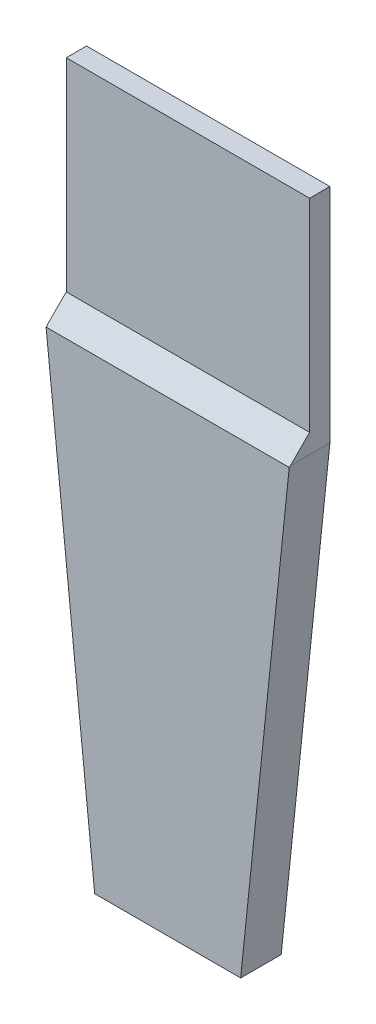
ISO-10303-21;
HEADER;
FILE_DESCRIPTION(('STEP AP214'),'2;1');
FILE_NAME('part.step','',(''),(''),'','','');
FILE_SCHEMA(('AUTOMOTIVE_DESIGN { 1 0 10303 214 1 1 1 1 }'));
ENDSEC;
DATA;
#1=APPLICATION_CONTEXT('core data for automotive mechanical design processes');
#2=APPLICATION_PROTOCOL_DEFINITION('international standard','automotive_design',2000,#1);
#3=PRODUCT_CONTEXT('',#1,'mechanical');
#4=PRODUCT('Part','Part','',(#3));
#5=PRODUCT_RELATED_PRODUCT_CATEGORY('part','',(#4));
#6=PRODUCT_DEFINITION_FORMATION('','',#4);
#7=PRODUCT_DEFINITION_CONTEXT('part definition',#1,'design');
#8=PRODUCT_DEFINITION('design','',#6,#7);
#9=PRODUCT_DEFINITION_SHAPE('','',#8);
#10=(LENGTH_UNIT() NAMED_UNIT(*) SI_UNIT(.MILLI.,.METRE.));
#11=(NAMED_UNIT(*) PLANE_ANGLE_UNIT() SI_UNIT($,.RADIAN.));
#12=(NAMED_UNIT(*) SI_UNIT($,.STERADIAN.) SOLID_ANGLE_UNIT());
#13=UNCERTAINTY_MEASURE_WITH_UNIT(LENGTH_MEASURE(1.E-05),#10,'distance_accuracy_value','');
#14=(GEOMETRIC_REPRESENTATION_CONTEXT(3) GLOBAL_UNCERTAINTY_ASSIGNED_CONTEXT((#13)) GLOBAL_UNIT_ASSIGNED_CONTEXT((#10,
#11,#12)) REPRESENTATION_CONTEXT('',''));
#15=CARTESIAN_POINT('',(0.,0.,0.));
#16=DIRECTION('',(0.,0.,1.));
#17=DIRECTION('',(1.,0.,0.));
#18=AXIS2_PLACEMENT_3D('',#15,#16,#17);
#19=CARTESIAN_POINT('',(3.59875595733219,-26.279472225827,1.));
#20=DIRECTION('',(-0.994618408890778,0.103606084259456,0.));
#21=DIRECTION('',(-0.103606084259456,-0.994618408890778,0.));
#22=AXIS2_PLACEMENT_3D('',#19,#20,#21);
#23=PLANE('',#22);
#24=DIRECTION('',(0.103606084259456,0.994618408890778,0.));
#25=VECTOR('',#24,1.);
#26=CARTESIAN_POINT('',(3.59875595733219,-26.279472225827,0.));
#27=LINE('',#26,#25);
#28=CARTESIAN_POINT('',(3.59875595733219,-26.279472225827,0.));
#29=VERTEX_POINT('',#28);
#30=CARTESIAN_POINT('',(6.,-3.22752941621612,0.));
#31=VERTEX_POINT('',#30);
#32=EDGE_CURVE('E116',#29,#31,#27,.T.);
#33=ORIENTED_EDGE('',*,*,#32,.T.);
#34=DIRECTION('',(0.,0.,-1.));
#35=VECTOR('',#34,1.);
#36=CARTESIAN_POINT('',(6.,-3.22752941621612,1.));
#37=LINE('',#36,#35);
#38=CARTESIAN_POINT('',(5.99999999999998,-3.22752941621633,1.94805719038928));
#39=VERTEX_POINT('',#38);
#40=EDGE_CURVE('E48',#39,#31,#37,.T.);
#41=ORIENTED_EDGE('',*,*,#40,.F.);
#42=DIRECTION('',(0.0734579584512907,0.705196401132391,-0.705196401132402));
#43=VECTOR('',#42,1.);
#44=CARTESIAN_POINT('',(6.09822306310959,-2.28458801036402,1.00511578453696));
#45=LINE('',#44,#43);
#46=CARTESIAN_POINT('',(5.99458929066553,-3.27947222582705,2.));
#47=VERTEX_POINT('',#46);
#48=EDGE_CURVE('E11',#47,#39,#45,.T.);
#49=ORIENTED_EDGE('',*,*,#48,.F.);
#50=DIRECTION('',(0.103606084259456,0.994618408890778,0.));
#51=VECTOR('',#50,1.);
#52=CARTESIAN_POINT('',(3.59875595733219,-26.279472225827,2.));
#53=LINE('',#52,#51);
#54=CARTESIAN_POINT('',(3.59875595733219,-26.279472225827,2.));
#55=VERTEX_POINT('',#54);
#56=EDGE_CURVE('E112',#55,#47,#53,.T.);
#57=ORIENTED_EDGE('',*,*,#56,.F.);
#58=DIRECTION('',(0.,0.,-1.));
#59=VECTOR('',#58,1.);
#60=CARTESIAN_POINT('',(3.59875595733219,-26.279472225827,1.));
#61=LINE('',#60,#59);
#62=EDGE_CURVE('E99',#55,#29,#61,.T.);
#63=ORIENTED_EDGE('',*,*,#62,.T.);
#64=EDGE_LOOP('',(#33,#41,#49,#57,#63));
#65=FACE_BOUND('',#64,.T.);
#66=ADVANCED_FACE('F34',(#65),#23,.F.);
#67=CARTESIAN_POINT('',(6.,-3.22752941621612,1.));
#68=DIRECTION('',(-1.,0.,0.));
#69=DIRECTION('',(0.,-1.,0.));
#70=AXIS2_PLACEMENT_3D('',#67,#68,#69);
#71=PLANE('',#70);
#72=DIRECTION('',(0.,-0.707106781186542,0.707106781186553));
#73=VECTOR('',#72,1.);
#74=CARTESIAN_POINT('',(5.99999999999998,-2.27947222582706,1.));
#75=LINE('',#74,#73);
#76=CARTESIAN_POINT('',(6.,-2.27947222582706,1.));
#77=VERTEX_POINT('',#76);
#78=EDGE_CURVE('E159',#77,#39,#75,.T.);
#79=ORIENTED_EDGE('',*,*,#78,.T.);
#80=ORIENTED_EDGE('',*,*,#40,.T.);
#81=DIRECTION('',(0.,1.,0.));
#82=VECTOR('',#81,1.);
#83=CARTESIAN_POINT('',(6.,-3.22752941621612,0.));
#84=LINE('',#83,#82);
#85=CARTESIAN_POINT('',(6.,7.72052777417295,0.));
#86=VERTEX_POINT('',#85);
#87=EDGE_CURVE('E119',#31,#86,#84,.T.);
#88=ORIENTED_EDGE('',*,*,#87,.T.);
#89=DIRECTION('',(0.,0.,-1.));
#90=VECTOR('',#89,1.);
#91=CARTESIAN_POINT('',(6.,7.72052777417295,1.));
#92=LINE('',#91,#90);
#93=CARTESIAN_POINT('',(6.,7.72052777417295,1.));
#94=VERTEX_POINT('',#93);
#95=EDGE_CURVE('E145',#94,#86,#92,.T.);
#96=ORIENTED_EDGE('',*,*,#95,.F.);
#97=DIRECTION('',(0.,1.,0.));
#98=VECTOR('',#97,1.);
#99=CARTESIAN_POINT('',(6.,-3.22752941621612,1.));
#100=LINE('',#99,#98);
#101=EDGE_CURVE('E125',#77,#94,#100,.T.);
#102=ORIENTED_EDGE('',*,*,#101,.F.);
#103=EDGE_LOOP('',(#79,#80,#88,#96,#102));
#104=FACE_BOUND('',#103,.T.);
#105=ADVANCED_FACE('F166',(#104),#71,.F.);
#106=CARTESIAN_POINT('',(6.,7.72052777417295,1.));
#107=DIRECTION('',(0.,-1.,0.));
#108=DIRECTION('',(0.,0.,-1.));
#109=AXIS2_PLACEMENT_3D('',#106,#107,#108);
#110=PLANE('',#109);
#111=DIRECTION('',(-1.,0.,0.));
#112=VECTOR('',#111,1.);
#113=CARTESIAN_POINT('',(6.,7.72052777417295,0.));
#114=LINE('',#113,#112);
#115=CARTESIAN_POINT('',(-6.,7.72052777417295,0.));
#116=VERTEX_POINT('',#115);
#117=EDGE_CURVE('E131',#86,#116,#114,.T.);
#118=ORIENTED_EDGE('',*,*,#117,.T.);
#119=DIRECTION('',(0.,0.,-1.));
#120=VECTOR('',#119,1.);
#121=CARTESIAN_POINT('',(-6.,7.72052777417295,1.));
#122=LINE('',#121,#120);
#123=CARTESIAN_POINT('',(-6.,7.72052777417295,1.));
#124=VERTEX_POINT('',#123);
#125=EDGE_CURVE('E142',#124,#116,#122,.T.);
#126=ORIENTED_EDGE('',*,*,#125,.F.);
#127=DIRECTION('',(-1.,0.,0.));
#128=VECTOR('',#127,1.);
#129=CARTESIAN_POINT('',(6.,7.72052777417295,1.));
#130=LINE('',#129,#128);
#131=EDGE_CURVE('E127',#94,#124,#130,.T.);
#132=ORIENTED_EDGE('',*,*,#131,.F.);
#133=ORIENTED_EDGE('',*,*,#95,.T.);
#134=EDGE_LOOP('',(#118,#126,#132,#133));
#135=FACE_BOUND('',#134,.T.);
#136=ADVANCED_FACE('F179',(#135),#110,.F.);
#137=CARTESIAN_POINT('',(-6.,7.72052777417295,1.));
#138=DIRECTION('',(1.,0.,0.));
#139=DIRECTION('',(0.,1.,0.));
#140=AXIS2_PLACEMENT_3D('',#137,#138,#139);
#141=PLANE('',#140);
#142=DIRECTION('',(0.,0.,-1.));
#143=VECTOR('',#142,1.);
#144=CARTESIAN_POINT('',(-6.,-3.22752941621613,1.));
#145=LINE('',#144,#143);
#146=CARTESIAN_POINT('',(-6.,-3.22752941621613,1.94805719038908));
#147=VERTEX_POINT('',#146);
#148=CARTESIAN_POINT('',(-6.,-3.22752941621613,0.));
#149=VERTEX_POINT('',#148);
#150=EDGE_CURVE('E139',#147,#149,#145,.T.);
#151=ORIENTED_EDGE('',*,*,#150,.F.);
#152=DIRECTION('',(0.,-0.707106781186542,0.707106781186553));
#153=VECTOR('',#152,1.);
#154=CARTESIAN_POINT('',(-5.99999999999998,-2.27947222582706,1.));
#155=LINE('',#154,#153);
#156=CARTESIAN_POINT('',(-5.99999999999998,-2.27947222582706,1.));
#157=VERTEX_POINT('',#156);
#158=EDGE_CURVE('E154',#157,#147,#155,.T.);
#159=ORIENTED_EDGE('',*,*,#158,.F.);
#160=DIRECTION('',(0.,-1.,0.));
#161=VECTOR('',#160,1.);
#162=CARTESIAN_POINT('',(-6.,7.72052777417295,1.));
#163=LINE('',#162,#161);
#164=EDGE_CURVE('E110',#124,#157,#163,.T.);
#165=ORIENTED_EDGE('',*,*,#164,.F.);
#166=ORIENTED_EDGE('',*,*,#125,.T.);
#167=DIRECTION('',(0.,-1.,0.));
#168=VECTOR('',#167,1.);
#169=CARTESIAN_POINT('',(-6.,7.72052777417295,0.));
#170=LINE('',#169,#168);
#171=EDGE_CURVE('E133',#116,#149,#170,.T.);
#172=ORIENTED_EDGE('',*,*,#171,.T.);
#173=EDGE_LOOP('',(#151,#159,#165,#166,#172));
#174=FACE_BOUND('',#173,.T.);
#175=ADVANCED_FACE('F171',(#174),#141,.F.);
#176=CARTESIAN_POINT('',(-6.,-3.22752941621613,1.));
#177=DIRECTION('',(0.994618408890778,0.103606084259456,0.));
#178=DIRECTION('',(-0.103606084259456,0.994618408890778,0.));
#179=AXIS2_PLACEMENT_3D('',#176,#177,#178);
#180=PLANE('',#179);
#181=DIRECTION('',(0.103606084259456,-0.994618408890778,0.));
#182=VECTOR('',#181,1.);
#183=CARTESIAN_POINT('',(-6.,-3.22752941621613,0.));
#184=LINE('',#183,#182);
#185=CARTESIAN_POINT('',(-3.5987559573322,-26.279472225827,0.));
#186=VERTEX_POINT('',#185);
#187=EDGE_CURVE('E135',#149,#186,#184,.T.);
#188=ORIENTED_EDGE('',*,*,#187,.T.);
#189=DIRECTION('',(0.,0.,-1.));
#190=VECTOR('',#189,1.);
#191=CARTESIAN_POINT('',(-3.5987559573322,-26.279472225827,1.));
#192=LINE('',#191,#190);
#193=CARTESIAN_POINT('',(-3.5987559573322,-26.279472225827,2.));
#194=VERTEX_POINT('',#193);
#195=EDGE_CURVE('E109',#194,#186,#192,.T.);
#196=ORIENTED_EDGE('',*,*,#195,.F.);
#197=DIRECTION('',(0.103606084259456,-0.994618408890778,0.));
#198=VECTOR('',#197,1.);
#199=CARTESIAN_POINT('',(-6.,-3.22752941621613,2.));
#200=LINE('',#199,#198);
#201=CARTESIAN_POINT('',(-5.99458929066553,-3.27947222582704,2.));
#202=VERTEX_POINT('',#201);
#203=EDGE_CURVE('E113',#202,#194,#200,.T.);
#204=ORIENTED_EDGE('',*,*,#203,.F.);
#205=DIRECTION('',(0.0734579584512908,-0.705196401132391,0.705196401132402));
#206=VECTOR('',#205,1.);
#207=CARTESIAN_POINT('',(-6.03347020319162,-2.90621546557661,1.62674323974956));
#208=LINE('',#207,#206);
#209=EDGE_CURVE('E41',#147,#202,#208,.T.);
#210=ORIENTED_EDGE('',*,*,#209,.F.);
#211=ORIENTED_EDGE('',*,*,#150,.T.);
#212=EDGE_LOOP('',(#188,#196,#204,#210,#211));
#213=FACE_BOUND('',#212,.T.);
#214=ADVANCED_FACE('F156',(#213),#180,.F.);
#215=CARTESIAN_POINT('',(-3.5987559573322,-26.279472225827,1.));
#216=DIRECTION('',(0.,1.,0.));
#217=DIRECTION('',(0.,0.,1.));
#218=AXIS2_PLACEMENT_3D('',#215,#216,#217);
#219=PLANE('',#218);
#220=ORIENTED_EDGE('',*,*,#62,.F.);
#221=DIRECTION('',(-1.,0.,0.));
#222=VECTOR('',#221,1.);
#223=CARTESIAN_POINT('',(5.99999999999998,-26.279472225827,2.));
#224=LINE('',#223,#222);
#225=EDGE_CURVE('E104',#55,#194,#224,.T.);
#226=ORIENTED_EDGE('',*,*,#225,.T.);
#227=ORIENTED_EDGE('',*,*,#195,.T.);
#228=DIRECTION('',(1.,0.,0.));
#229=VECTOR('',#228,1.);
#230=CARTESIAN_POINT('',(-3.5987559573322,-26.279472225827,0.));
#231=LINE('',#230,#229);
#232=EDGE_CURVE('E107',#186,#29,#231,.T.);
#233=ORIENTED_EDGE('',*,*,#232,.T.);
#234=EDGE_LOOP('',(#220,#226,#227,#233));
#235=FACE_BOUND('',#234,.T.);
#236=ADVANCED_FACE('F101',(#235),#219,.F.);
#237=CARTESIAN_POINT('',(0.,0.,1.));
#238=DIRECTION('',(0.,0.,1.));
#239=DIRECTION('',(1.,0.,0.));
#240=AXIS2_PLACEMENT_3D('',#237,#238,#239);
#241=PLANE('',#240);
#242=DIRECTION('',(-1.,0.,0.));
#243=VECTOR('',#242,1.);
#244=CARTESIAN_POINT('',(5.99999999999998,-2.27947222582706,1.));
#245=LINE('',#244,#243);
#246=EDGE_CURVE('E117',#77,#157,#245,.T.);
#247=ORIENTED_EDGE('',*,*,#246,.F.);
#248=ORIENTED_EDGE('',*,*,#101,.T.);
#249=ORIENTED_EDGE('',*,*,#131,.T.);
#250=ORIENTED_EDGE('',*,*,#164,.T.);
#251=EDGE_LOOP('',(#247,#248,#249,#250));
#252=FACE_BOUND('',#251,.T.);
#253=ADVANCED_FACE('F180',(#252),#241,.T.);
#254=CARTESIAN_POINT('',(0.,0.,0.));
#255=DIRECTION('',(0.,0.,1.));
#256=DIRECTION('',(1.,0.,0.));
#257=AXIS2_PLACEMENT_3D('',#254,#255,#256);
#258=PLANE('',#257);
#259=ORIENTED_EDGE('',*,*,#32,.F.);
#260=ORIENTED_EDGE('',*,*,#232,.F.);
#261=ORIENTED_EDGE('',*,*,#187,.F.);
#262=ORIENTED_EDGE('',*,*,#171,.F.);
#263=ORIENTED_EDGE('',*,*,#117,.F.);
#264=ORIENTED_EDGE('',*,*,#87,.F.);
#265=EDGE_LOOP('',(#259,#260,#261,#262,#263,#264));
#266=FACE_BOUND('',#265,.T.);
#267=ADVANCED_FACE('F176',(#266),#258,.F.);
#268=CARTESIAN_POINT('',(5.99999999999998,-3.27947222582704,2.));
#269=DIRECTION('',(0.,0.,-1.));
#270=DIRECTION('',(0.,1.,0.));
#271=AXIS2_PLACEMENT_3D('',#268,#269,#270);
#272=PLANE('',#271);
#273=ORIENTED_EDGE('',*,*,#225,.F.);
#274=ORIENTED_EDGE('',*,*,#56,.T.);
#275=DIRECTION('',(-1.,0.,0.));
#276=VECTOR('',#275,1.);
#277=CARTESIAN_POINT('',(5.99999999999998,-3.27947222582704,2.));
#278=LINE('',#277,#276);
#279=EDGE_CURVE('E55',#47,#202,#278,.T.);
#280=ORIENTED_EDGE('',*,*,#279,.T.);
#281=ORIENTED_EDGE('',*,*,#203,.T.);
#282=EDGE_LOOP('',(#273,#274,#280,#281));
#283=FACE_BOUND('',#282,.T.);
#284=ADVANCED_FACE('F115',(#283),#272,.F.);
#285=CARTESIAN_POINT('',(5.99999999999998,-2.27947222582706,1.));
#286=DIRECTION('',(0.,-0.707106781186553,-0.707106781186542));
#287=DIRECTION('',(0.,0.707106781186542,-0.707106781186553));
#288=AXIS2_PLACEMENT_3D('',#285,#286,#287);
#289=PLANE('',#288);
#290=ORIENTED_EDGE('',*,*,#279,.F.);
#291=ORIENTED_EDGE('',*,*,#48,.T.);
#292=ORIENTED_EDGE('',*,*,#78,.F.);
#293=ORIENTED_EDGE('',*,*,#246,.T.);
#294=ORIENTED_EDGE('',*,*,#158,.T.);
#295=ORIENTED_EDGE('',*,*,#209,.T.);
#296=EDGE_LOOP('',(#290,#291,#292,#293,#294,#295));
#297=FACE_BOUND('',#296,.T.);
#298=ADVANCED_FACE('F152',(#297),#289,.F.);
#299=CLOSED_SHELL('',(#66,#105,#136,#175,#214,#236,#253,#267,#284,#298));
#300=MANIFOLD_SOLID_BREP('B2',#299);
#301=ADVANCED_BREP_SHAPE_REPRESENTATION('',(#18,#300),#14);
#302=SHAPE_DEFINITION_REPRESENTATION(#9,#301);
ENDSEC;
END-ISO-10303-21;
